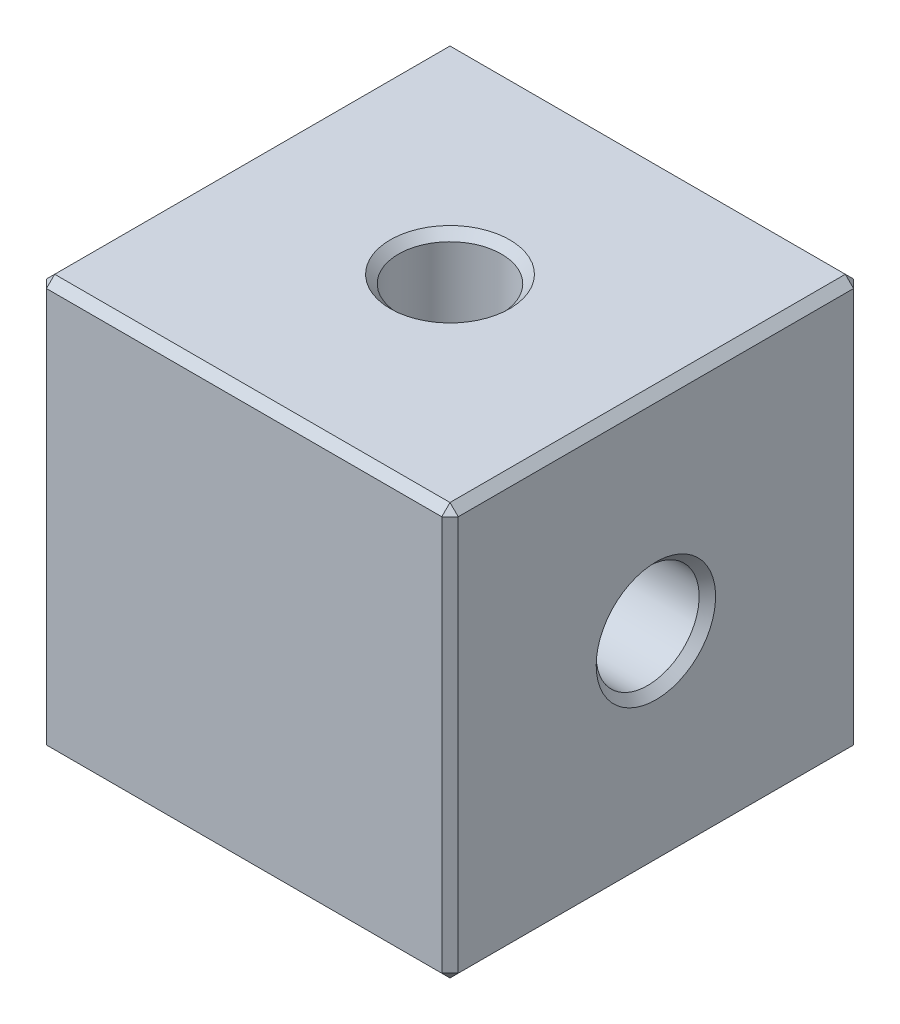
ISO-10303-21;
HEADER;
FILE_DESCRIPTION(('STEP AP214'),'2;1');
FILE_NAME('part.step','',(''),(''),'','','');
FILE_SCHEMA(('AUTOMOTIVE_DESIGN { 1 0 10303 214 1 1 1 1 }'));
ENDSEC;
DATA;
#1=APPLICATION_CONTEXT('core data for automotive mechanical design processes');
#2=APPLICATION_PROTOCOL_DEFINITION('international standard','automotive_design',2000,#1);
#3=PRODUCT_CONTEXT('',#1,'mechanical');
#4=PRODUCT('Part','Part','',(#3));
#5=PRODUCT_RELATED_PRODUCT_CATEGORY('part','',(#4));
#6=PRODUCT_DEFINITION_FORMATION('','',#4);
#7=PRODUCT_DEFINITION_CONTEXT('part definition',#1,'design');
#8=PRODUCT_DEFINITION('design','',#6,#7);
#9=PRODUCT_DEFINITION_SHAPE('','',#8);
#10=(LENGTH_UNIT() NAMED_UNIT(*) SI_UNIT(.MILLI.,.METRE.));
#11=(NAMED_UNIT(*) PLANE_ANGLE_UNIT() SI_UNIT($,.RADIAN.));
#12=(NAMED_UNIT(*) SI_UNIT($,.STERADIAN.) SOLID_ANGLE_UNIT());
#13=UNCERTAINTY_MEASURE_WITH_UNIT(LENGTH_MEASURE(1.E-05),#10,'distance_accuracy_value','');
#14=(GEOMETRIC_REPRESENTATION_CONTEXT(3) GLOBAL_UNCERTAINTY_ASSIGNED_CONTEXT((#13)) GLOBAL_UNIT_ASSIGNED_CONTEXT((#10,
#11,#12)) REPRESENTATION_CONTEXT('',''));
#15=CARTESIAN_POINT('',(0.,0.,0.));
#16=DIRECTION('',(0.,0.,1.));
#17=DIRECTION('',(1.,0.,0.));
#18=AXIS2_PLACEMENT_3D('',#15,#16,#17);
#19=CARTESIAN_POINT('',(5.,5.,-5.));
#20=DIRECTION('',(-1.,0.,0.));
#21=DIRECTION('',(0.,0.,1.));
#22=AXIS2_PLACEMENT_3D('',#19,#20,#21);
#23=PLANE('',#22);
#24=CARTESIAN_POINT('',(5.,0.,0.));
#25=DIRECTION('',(-1.,0.,0.));
#26=DIRECTION('',(0.,0.,1.));
#27=AXIS2_PLACEMENT_3D('',#24,#25,#26);
#28=CIRCLE('',#27,1.44999999999998);
#29=CARTESIAN_POINT('',(5.,0.,1.44999999999998));
#30=VERTEX_POINT('',#29);
#31=EDGE_CURVE('E166',#30,#30,#28,.T.);
#32=ORIENTED_EDGE('',*,*,#31,.T.);
#33=EDGE_LOOP('',(#32));
#34=FACE_BOUND('',#33,.T.);
#35=DIRECTION('',(0.,0.,-1.));
#36=VECTOR('',#35,1.);
#37=CARTESIAN_POINT('',(5.,-4.8,-5.));
#38=LINE('',#37,#36);
#39=CARTESIAN_POINT('',(5.,-4.8,4.8));
#40=VERTEX_POINT('',#39);
#41=CARTESIAN_POINT('',(5.,-4.8,-4.8));
#42=VERTEX_POINT('',#41);
#43=EDGE_CURVE('E165',#40,#42,#38,.T.);
#44=ORIENTED_EDGE('',*,*,#43,.T.);
#45=DIRECTION('',(0.,1.,0.));
#46=VECTOR('',#45,1.);
#47=CARTESIAN_POINT('',(5.,5.,-4.8));
#48=LINE('',#47,#46);
#49=CARTESIAN_POINT('',(5.,4.8,-4.8));
#50=VERTEX_POINT('',#49);
#51=EDGE_CURVE('E140',#42,#50,#48,.T.);
#52=ORIENTED_EDGE('',*,*,#51,.T.);
#53=DIRECTION('',(0.,0.,1.));
#54=VECTOR('',#53,1.);
#55=CARTESIAN_POINT('',(5.,4.8,5.));
#56=LINE('',#55,#54);
#57=CARTESIAN_POINT('',(5.,4.8,4.8));
#58=VERTEX_POINT('',#57);
#59=EDGE_CURVE('E156',#50,#58,#56,.T.);
#60=ORIENTED_EDGE('',*,*,#59,.T.);
#61=DIRECTION('',(0.,-1.,0.));
#62=VECTOR('',#61,1.);
#63=CARTESIAN_POINT('',(5.,5.,4.8));
#64=LINE('',#63,#62);
#65=EDGE_CURVE('E161',#58,#40,#64,.T.);
#66=ORIENTED_EDGE('',*,*,#65,.T.);
#67=EDGE_LOOP('',(#44,#52,#60,#66));
#68=FACE_BOUND('',#67,.T.);
#69=ADVANCED_FACE('F43',(#34,#68),#23,.F.);
#70=CARTESIAN_POINT('',(-5.,5.,-5.));
#71=DIRECTION('',(0.,0.,1.));
#72=DIRECTION('',(1.,0.,0.));
#73=AXIS2_PLACEMENT_3D('',#70,#71,#72);
#74=PLANE('',#73);
#75=DIRECTION('',(-1.,0.,0.));
#76=VECTOR('',#75,1.);
#77=CARTESIAN_POINT('',(-5.,-4.8,-5.));
#78=LINE('',#77,#76);
#79=CARTESIAN_POINT('',(4.8,-4.8,-5.));
#80=VERTEX_POINT('',#79);
#81=CARTESIAN_POINT('',(-4.8,-4.8,-5.));
#82=VERTEX_POINT('',#81);
#83=EDGE_CURVE('E194',#80,#82,#78,.T.);
#84=ORIENTED_EDGE('',*,*,#83,.T.);
#85=DIRECTION('',(0.,1.,0.));
#86=VECTOR('',#85,1.);
#87=CARTESIAN_POINT('',(-4.8,5.,-5.));
#88=LINE('',#87,#86);
#89=CARTESIAN_POINT('',(-4.8,4.8,-5.));
#90=VERTEX_POINT('',#89);
#91=EDGE_CURVE('E196',#82,#90,#88,.T.);
#92=ORIENTED_EDGE('',*,*,#91,.T.);
#93=DIRECTION('',(1.,0.,0.));
#94=VECTOR('',#93,1.);
#95=CARTESIAN_POINT('',(5.,4.8,-5.));
#96=LINE('',#95,#94);
#97=CARTESIAN_POINT('',(4.8,4.8,-5.));
#98=VERTEX_POINT('',#97);
#99=EDGE_CURVE('E191',#90,#98,#96,.T.);
#100=ORIENTED_EDGE('',*,*,#99,.T.);
#101=DIRECTION('',(0.,-1.,0.));
#102=VECTOR('',#101,1.);
#103=CARTESIAN_POINT('',(4.8,5.,-5.));
#104=LINE('',#103,#102);
#105=EDGE_CURVE('E142',#98,#80,#104,.T.);
#106=ORIENTED_EDGE('',*,*,#105,.T.);
#107=EDGE_LOOP('',(#84,#92,#100,#106));
#108=FACE_BOUND('',#107,.T.);
#109=ADVANCED_FACE('F325',(#108),#74,.F.);
#110=CARTESIAN_POINT('',(-5.,5.,-5.));
#111=DIRECTION('',(1.,0.,0.));
#112=DIRECTION('',(0.,0.,-1.));
#113=AXIS2_PLACEMENT_3D('',#110,#111,#112);
#114=PLANE('',#113);
#115=DIRECTION('',(0.,-1.,0.));
#116=VECTOR('',#115,1.);
#117=CARTESIAN_POINT('',(-5.,5.,-4.8));
#118=LINE('',#117,#116);
#119=CARTESIAN_POINT('',(-5.,4.8,-4.8));
#120=VERTEX_POINT('',#119);
#121=CARTESIAN_POINT('',(-5.,-4.8,-4.8));
#122=VERTEX_POINT('',#121);
#123=EDGE_CURVE('E177',#120,#122,#118,.T.);
#124=ORIENTED_EDGE('',*,*,#123,.T.);
#125=DIRECTION('',(0.,0.,1.));
#126=VECTOR('',#125,1.);
#127=CARTESIAN_POINT('',(-5.,-4.8,-5.));
#128=LINE('',#127,#126);
#129=CARTESIAN_POINT('',(-5.,-4.8,4.8));
#130=VERTEX_POINT('',#129);
#131=EDGE_CURVE('E179',#122,#130,#128,.T.);
#132=ORIENTED_EDGE('',*,*,#131,.T.);
#133=DIRECTION('',(0.,1.,0.));
#134=VECTOR('',#133,1.);
#135=CARTESIAN_POINT('',(-5.,5.,4.8));
#136=LINE('',#135,#134);
#137=CARTESIAN_POINT('',(-5.,4.8,4.8));
#138=VERTEX_POINT('',#137);
#139=EDGE_CURVE('E175',#130,#138,#136,.T.);
#140=ORIENTED_EDGE('',*,*,#139,.T.);
#141=DIRECTION('',(0.,0.,-1.));
#142=VECTOR('',#141,1.);
#143=CARTESIAN_POINT('',(-5.,4.8,-5.));
#144=LINE('',#143,#142);
#145=EDGE_CURVE('E169',#138,#120,#144,.T.);
#146=ORIENTED_EDGE('',*,*,#145,.T.);
#147=EDGE_LOOP('',(#124,#132,#140,#146));
#148=FACE_BOUND('',#147,.T.);
#149=ADVANCED_FACE('F331',(#148),#114,.F.);
#150=CARTESIAN_POINT('',(-5.,5.,5.));
#151=DIRECTION('',(0.,0.,-1.));
#152=DIRECTION('',(-1.,0.,0.));
#153=AXIS2_PLACEMENT_3D('',#150,#151,#152);
#154=PLANE('',#153);
#155=DIRECTION('',(-1.,0.,0.));
#156=VECTOR('',#155,1.);
#157=CARTESIAN_POINT('',(-5.,4.8,5.));
#158=LINE('',#157,#156);
#159=CARTESIAN_POINT('',(4.8,4.8,5.));
#160=VERTEX_POINT('',#159);
#161=CARTESIAN_POINT('',(-4.8,4.8,5.));
#162=VERTEX_POINT('',#161);
#163=EDGE_CURVE('E199',#160,#162,#158,.T.);
#164=ORIENTED_EDGE('',*,*,#163,.T.);
#165=DIRECTION('',(0.,-1.,0.));
#166=VECTOR('',#165,1.);
#167=CARTESIAN_POINT('',(-4.8,5.,5.));
#168=LINE('',#167,#166);
#169=CARTESIAN_POINT('',(-4.8,-4.8,5.));
#170=VERTEX_POINT('',#169);
#171=EDGE_CURVE('E205',#162,#170,#168,.T.);
#172=ORIENTED_EDGE('',*,*,#171,.T.);
#173=DIRECTION('',(1.,0.,0.));
#174=VECTOR('',#173,1.);
#175=CARTESIAN_POINT('',(-5.,-4.8,5.));
#176=LINE('',#175,#174);
#177=CARTESIAN_POINT('',(4.8,-4.8,5.));
#178=VERTEX_POINT('',#177);
#179=EDGE_CURVE('E203',#170,#178,#176,.T.);
#180=ORIENTED_EDGE('',*,*,#179,.T.);
#181=DIRECTION('',(0.,1.,0.));
#182=VECTOR('',#181,1.);
#183=CARTESIAN_POINT('',(4.8,5.,5.));
#184=LINE('',#183,#182);
#185=EDGE_CURVE('E201',#178,#160,#184,.T.);
#186=ORIENTED_EDGE('',*,*,#185,.T.);
#187=EDGE_LOOP('',(#164,#172,#180,#186));
#188=FACE_BOUND('',#187,.T.);
#189=ADVANCED_FACE('F297',(#188),#154,.F.);
#190=CARTESIAN_POINT('',(0.,5.,0.));
#191=DIRECTION('',(0.,1.,0.));
#192=DIRECTION('',(0.,0.,1.));
#193=AXIS2_PLACEMENT_3D('',#190,#191,#192);
#194=PLANE('',#193);
#195=DIRECTION('',(0.,0.,1.));
#196=VECTOR('',#195,1.);
#197=CARTESIAN_POINT('',(-4.8,5.,5.));
#198=LINE('',#197,#196);
#199=CARTESIAN_POINT('',(-4.80000000000001,5.,-4.8));
#200=VERTEX_POINT('',#199);
#201=CARTESIAN_POINT('',(-4.8,5.,4.8));
#202=VERTEX_POINT('',#201);
#203=EDGE_CURVE('E61',#200,#202,#198,.T.);
#204=ORIENTED_EDGE('',*,*,#203,.T.);
#205=DIRECTION('',(1.,0.,0.));
#206=VECTOR('',#205,1.);
#207=CARTESIAN_POINT('',(5.,5.,4.8));
#208=LINE('',#207,#206);
#209=CARTESIAN_POINT('',(4.8,5.,4.8));
#210=VERTEX_POINT('',#209);
#211=EDGE_CURVE('E53',#202,#210,#208,.T.);
#212=ORIENTED_EDGE('',*,*,#211,.T.);
#213=DIRECTION('',(0.,0.,-1.));
#214=VECTOR('',#213,1.);
#215=CARTESIAN_POINT('',(4.8,5.,-5.));
#216=LINE('',#215,#214);
#217=CARTESIAN_POINT('',(4.8,5.,-4.8));
#218=VERTEX_POINT('',#217);
#219=EDGE_CURVE('E211',#210,#218,#216,.T.);
#220=ORIENTED_EDGE('',*,*,#219,.T.);
#221=DIRECTION('',(-1.,0.,0.));
#222=VECTOR('',#221,1.);
#223=CARTESIAN_POINT('',(-5.,5.,-4.8));
#224=LINE('',#223,#222);
#225=EDGE_CURVE('E66',#218,#200,#224,.T.);
#226=ORIENTED_EDGE('',*,*,#225,.T.);
#227=EDGE_LOOP('',(#204,#212,#220,#226));
#228=FACE_BOUND('',#227,.T.);
#229=CARTESIAN_POINT('',(0.,5.,0.));
#230=DIRECTION('',(0.,1.,0.));
#231=DIRECTION('',(0.,0.,1.));
#232=AXIS2_PLACEMENT_3D('',#229,#230,#231);
#233=CIRCLE('',#232,1.44999999999999);
#234=CARTESIAN_POINT('',(0.,5.,1.44999999999999));
#235=VERTEX_POINT('',#234);
#236=EDGE_CURVE('E208',#235,#235,#233,.F.);
#237=ORIENTED_EDGE('',*,*,#236,.T.);
#238=EDGE_LOOP('',(#237));
#239=FACE_BOUND('',#238,.T.);
#240=ADVANCED_FACE('F276',(#228,#239),#194,.T.);
#241=CARTESIAN_POINT('',(0.,-5.,0.));
#242=DIRECTION('',(0.,1.,0.));
#243=DIRECTION('',(0.,0.,1.));
#244=AXIS2_PLACEMENT_3D('',#241,#242,#243);
#245=PLANE('',#244);
#246=DIRECTION('',(-1.,0.,0.));
#247=VECTOR('',#246,1.);
#248=CARTESIAN_POINT('',(0.,-5.,4.8));
#249=LINE('',#248,#247);
#250=CARTESIAN_POINT('',(4.8,-5.,4.8));
#251=VERTEX_POINT('',#250);
#252=CARTESIAN_POINT('',(-4.8,-5.,4.8));
#253=VERTEX_POINT('',#252);
#254=EDGE_CURVE('E182',#251,#253,#249,.T.);
#255=ORIENTED_EDGE('',*,*,#254,.T.);
#256=DIRECTION('',(0.,0.,-1.));
#257=VECTOR('',#256,1.);
#258=CARTESIAN_POINT('',(-4.8,-5.,0.));
#259=LINE('',#258,#257);
#260=CARTESIAN_POINT('',(-4.8,-5.,-4.8));
#261=VERTEX_POINT('',#260);
#262=EDGE_CURVE('E188',#253,#261,#259,.T.);
#263=ORIENTED_EDGE('',*,*,#262,.T.);
#264=DIRECTION('',(1.,0.,0.));
#265=VECTOR('',#264,1.);
#266=CARTESIAN_POINT('',(0.,-5.,-4.8));
#267=LINE('',#266,#265);
#268=CARTESIAN_POINT('',(4.8,-5.,-4.8));
#269=VERTEX_POINT('',#268);
#270=EDGE_CURVE('E186',#261,#269,#267,.T.);
#271=ORIENTED_EDGE('',*,*,#270,.T.);
#272=DIRECTION('',(0.,0.,1.));
#273=VECTOR('',#272,1.);
#274=CARTESIAN_POINT('',(4.8,-5.,0.));
#275=LINE('',#274,#273);
#276=EDGE_CURVE('E184',#269,#251,#275,.T.);
#277=ORIENTED_EDGE('',*,*,#276,.T.);
#278=EDGE_LOOP('',(#255,#263,#271,#277));
#279=FACE_BOUND('',#278,.T.);
#280=ADVANCED_FACE('F321',(#279),#245,.F.);
#281=CARTESIAN_POINT('',(0.,5.,0.));
#282=DIRECTION('',(0.,1.,0.));
#283=DIRECTION('',(0.,0.,1.));
#284=AXIS2_PLACEMENT_3D('',#281,#282,#283);
#285=CYLINDRICAL_SURFACE('',#284,1.24999999998267);
#286=CARTESIAN_POINT('',(0.,4.79999999998269,0.));
#287=DIRECTION('',(0.,1.,0.));
#288=DIRECTION('',(0.,0.,1.));
#289=AXIS2_PLACEMENT_3D('',#286,#287,#288);
#290=CIRCLE('',#289,1.24999999998267);
#291=CARTESIAN_POINT('',(0.,4.79999999998269,1.24999999998267));
#292=VERTEX_POINT('',#291);
#293=EDGE_CURVE('E11',#292,#292,#290,.T.);
#294=ORIENTED_EDGE('',*,*,#293,.T.);
#295=EDGE_LOOP('',(#294));
#296=FACE_BOUND('',#295,.T.);
#297=CARTESIAN_POINT('',(0.,1.74122868901172E-11,0.));
#298=DIRECTION('',(-0.707106781186547,0.707106781186548,0.));
#299=DIRECTION('',(0.707106781186548,0.707106781186547,0.));
#300=AXIS2_PLACEMENT_3D('',#297,#298,#299);
#301=ELLIPSE('',#300,1.76776695294187,1.24999999998267);
#302=CARTESIAN_POINT('',(1.24999999998267,1.25000000000009,0.));
#303=VERTEX_POINT('',#302);
#304=EDGE_CURVE('E154',#303,#303,#301,.F.);
#305=ORIENTED_EDGE('',*,*,#304,.T.);
#306=EDGE_LOOP('',(#305));
#307=FACE_BOUND('',#306,.T.);
#308=ADVANCED_FACE('F308',(#296,#307),#285,.F.);
#309=CARTESIAN_POINT('',(5.,0.,0.));
#310=DIRECTION('',(1.,0.,0.));
#311=DIRECTION('',(0.,0.,-1.));
#312=AXIS2_PLACEMENT_3D('',#309,#310,#311);
#313=CYLINDRICAL_SURFACE('',#312,1.24999999998267);
#314=CARTESIAN_POINT('',(4.79999999998269,0.,0.));
#315=DIRECTION('',(-1.,0.,0.));
#316=DIRECTION('',(0.,0.,1.));
#317=AXIS2_PLACEMENT_3D('',#314,#315,#316);
#318=CIRCLE('',#317,1.24999999998267);
#319=CARTESIAN_POINT('',(4.79999999998269,0.,1.24999999998267));
#320=VERTEX_POINT('',#319);
#321=EDGE_CURVE('E162',#320,#320,#318,.F.);
#322=ORIENTED_EDGE('',*,*,#321,.T.);
#323=EDGE_LOOP('',(#322));
#324=FACE_BOUND('',#323,.T.);
#325=ORIENTED_EDGE('',*,*,#304,.F.);
#326=EDGE_LOOP('',(#325));
#327=FACE_BOUND('',#326,.T.);
#328=ADVANCED_FACE('F310',(#324,#327),#313,.F.);
#329=CARTESIAN_POINT('',(4.79999999998269,0.,0.));
#330=DIRECTION('',(1.,0.,0.));
#331=DIRECTION('',(0.,0.,-1.));
#332=AXIS2_PLACEMENT_3D('',#329,#330,#331);
#333=CONICAL_SURFACE('',#332,1.24999999998267,0.785398163397453);
#334=ORIENTED_EDGE('',*,*,#31,.F.);
#335=EDGE_LOOP('',(#334));
#336=FACE_BOUND('',#335,.T.);
#337=ORIENTED_EDGE('',*,*,#321,.F.);
#338=EDGE_LOOP('',(#337));
#339=FACE_BOUND('',#338,.T.);
#340=ADVANCED_FACE('F312',(#336,#339),#333,.F.);
#341=CARTESIAN_POINT('',(4.8,5.,0.));
#342=DIRECTION('',(0.707106781186554,0.707106781186541,0.));
#343=DIRECTION('',(0.,0.,1.));
#344=AXIS2_PLACEMENT_3D('',#341,#342,#343);
#345=PLANE('',#344);
#346=DIRECTION('',(0.707106781186541,-0.707106781186555,0.));
#347=VECTOR('',#346,1.);
#348=CARTESIAN_POINT('',(5.,4.8,-4.8));
#349=LINE('',#348,#347);
#350=EDGE_CURVE('E48',#218,#50,#349,.T.);
#351=ORIENTED_EDGE('',*,*,#350,.F.);
#352=ORIENTED_EDGE('',*,*,#219,.F.);
#353=DIRECTION('',(-0.70710678118654,0.707106781186554,0.));
#354=VECTOR('',#353,1.);
#355=CARTESIAN_POINT('',(4.9,4.9,4.8));
#356=LINE('',#355,#354);
#357=EDGE_CURVE('E145',#58,#210,#356,.T.);
#358=ORIENTED_EDGE('',*,*,#357,.F.);
#359=ORIENTED_EDGE('',*,*,#59,.F.);
#360=EDGE_LOOP('',(#351,#352,#358,#359));
#361=FACE_BOUND('',#360,.T.);
#362=ADVANCED_FACE('F157',(#361),#345,.T.);
#363=CARTESIAN_POINT('',(5.,4.8,-4.8));
#364=DIRECTION('',(0.577350269189637,0.577350269189615,-0.577350269189625));
#365=DIRECTION('',(-0.70710678118654,0.,-0.707106781186555));
#366=AXIS2_PLACEMENT_3D('',#363,#364,#365);
#367=PLANE('',#366);
#368=DIRECTION('',(0.,0.707106781186554,0.707106781186541));
#369=VECTOR('',#368,1.);
#370=CARTESIAN_POINT('',(4.8,4.9,-4.9));
#371=LINE('',#370,#369);
#372=EDGE_CURVE('E146',#218,#98,#371,.F.);
#373=ORIENTED_EDGE('',*,*,#372,.F.);
#374=ORIENTED_EDGE('',*,*,#350,.T.);
#375=DIRECTION('',(0.70710678118654,0.,0.707106781186555));
#376=VECTOR('',#375,1.);
#377=CARTESIAN_POINT('',(5.,4.8,-4.8));
#378=LINE('',#377,#376);
#379=EDGE_CURVE('E135',#98,#50,#378,.T.);
#380=ORIENTED_EDGE('',*,*,#379,.F.);
#381=EDGE_LOOP('',(#373,#374,#380));
#382=FACE_BOUND('',#381,.T.);
#383=ADVANCED_FACE('F150',(#382),#367,.T.);
#384=CARTESIAN_POINT('',(4.8,4.8,5.));
#385=DIRECTION('',(0.577350269189637,0.577350269189615,0.577350269189625));
#386=DIRECTION('',(0.70710678118654,0.,-0.707106781186555));
#387=AXIS2_PLACEMENT_3D('',#384,#385,#386);
#388=PLANE('',#387);
#389=DIRECTION('',(-0.70710678118654,0.,0.707106781186555));
#390=VECTOR('',#389,1.);
#391=CARTESIAN_POINT('',(4.8,4.8,5.));
#392=LINE('',#391,#390);
#393=EDGE_CURVE('E266',#58,#160,#392,.T.);
#394=ORIENTED_EDGE('',*,*,#393,.F.);
#395=ORIENTED_EDGE('',*,*,#357,.T.);
#396=DIRECTION('',(0.,-0.707106781186554,0.707106781186541));
#397=VECTOR('',#396,1.);
#398=CARTESIAN_POINT('',(4.8,4.8,5.));
#399=LINE('',#398,#397);
#400=EDGE_CURVE('E269',#160,#210,#399,.F.);
#401=ORIENTED_EDGE('',*,*,#400,.F.);
#402=EDGE_LOOP('',(#394,#395,#401));
#403=FACE_BOUND('',#402,.T.);
#404=ADVANCED_FACE('F273',(#403),#388,.T.);
#405=CARTESIAN_POINT('',(4.8,5.,-5.));
#406=DIRECTION('',(-0.707106781186555,0.,0.70710678118654));
#407=DIRECTION('',(0.,-1.,0.));
#408=AXIS2_PLACEMENT_3D('',#405,#406,#407);
#409=PLANE('',#408);
#410=ORIENTED_EDGE('',*,*,#379,.T.);
#411=ORIENTED_EDGE('',*,*,#51,.F.);
#412=DIRECTION('',(-0.70710678118654,0.,-0.707106781186555));
#413=VECTOR('',#412,1.);
#414=CARTESIAN_POINT('',(4.9,-4.8,-4.9));
#415=LINE('',#414,#413);
#416=EDGE_CURVE('E260',#80,#42,#415,.F.);
#417=ORIENTED_EDGE('',*,*,#416,.F.);
#418=ORIENTED_EDGE('',*,*,#105,.F.);
#419=EDGE_LOOP('',(#410,#411,#417,#418));
#420=FACE_BOUND('',#419,.T.);
#421=ADVANCED_FACE('F137',(#420),#409,.F.);
#422=CARTESIAN_POINT('',(0.,5.,-4.8));
#423=DIRECTION('',(0.,0.707106781186541,-0.707106781186554));
#424=DIRECTION('',(1.,0.,0.));
#425=AXIS2_PLACEMENT_3D('',#422,#423,#424);
#426=PLANE('',#425);
#427=ORIENTED_EDGE('',*,*,#372,.T.);
#428=ORIENTED_EDGE('',*,*,#99,.F.);
#429=DIRECTION('',(0.,-0.707106781186553,-0.707106781186541));
#430=VECTOR('',#429,1.);
#431=CARTESIAN_POINT('',(-4.8,4.8,-5.));
#432=LINE('',#431,#430);
#433=EDGE_CURVE('E257',#200,#90,#432,.T.);
#434=ORIENTED_EDGE('',*,*,#433,.F.);
#435=ORIENTED_EDGE('',*,*,#225,.F.);
#436=EDGE_LOOP('',(#427,#428,#434,#435));
#437=FACE_BOUND('',#436,.T.);
#438=ADVANCED_FACE('F436',(#437),#426,.T.);
#439=CARTESIAN_POINT('',(-4.8,5.,0.));
#440=DIRECTION('',(-0.707106781186554,0.707106781186541,0.));
#441=DIRECTION('',(0.,0.,-1.));
#442=AXIS2_PLACEMENT_3D('',#439,#440,#441);
#443=PLANE('',#442);
#444=DIRECTION('',(-0.707106781186541,-0.707106781186554,0.));
#445=VECTOR('',#444,1.);
#446=CARTESIAN_POINT('',(-5.,4.8,4.8));
#447=LINE('',#446,#445);
#448=EDGE_CURVE('E251',#202,#138,#447,.T.);
#449=ORIENTED_EDGE('',*,*,#448,.F.);
#450=ORIENTED_EDGE('',*,*,#203,.F.);
#451=DIRECTION('',(0.707106781186541,0.707106781186554,0.));
#452=VECTOR('',#451,1.);
#453=CARTESIAN_POINT('',(-4.9,4.9,-4.8));
#454=LINE('',#453,#452);
#455=EDGE_CURVE('E254',#120,#200,#454,.T.);
#456=ORIENTED_EDGE('',*,*,#455,.F.);
#457=ORIENTED_EDGE('',*,*,#145,.F.);
#458=EDGE_LOOP('',(#449,#450,#456,#457));
#459=FACE_BOUND('',#458,.T.);
#460=ADVANCED_FACE('F285',(#459),#443,.T.);
#461=CARTESIAN_POINT('',(0.,5.,4.8));
#462=DIRECTION('',(0.,0.707106781186541,0.707106781186554));
#463=DIRECTION('',(-1.,0.,0.));
#464=AXIS2_PLACEMENT_3D('',#461,#462,#463);
#465=PLANE('',#464);
#466=ORIENTED_EDGE('',*,*,#400,.T.);
#467=ORIENTED_EDGE('',*,*,#211,.F.);
#468=DIRECTION('',(0.,0.707106781186554,-0.707106781186541));
#469=VECTOR('',#468,1.);
#470=CARTESIAN_POINT('',(-4.8,4.9,4.9));
#471=LINE('',#470,#469);
#472=EDGE_CURVE('E248',#162,#202,#471,.T.);
#473=ORIENTED_EDGE('',*,*,#472,.F.);
#474=ORIENTED_EDGE('',*,*,#163,.F.);
#475=EDGE_LOOP('',(#466,#467,#473,#474));
#476=FACE_BOUND('',#475,.T.);
#477=ADVANCED_FACE('F281',(#476),#465,.T.);
#478=CARTESIAN_POINT('',(5.,5.,4.8));
#479=DIRECTION('',(-0.707106781186555,0.,-0.70710678118654));
#480=DIRECTION('',(0.,-1.,0.));
#481=AXIS2_PLACEMENT_3D('',#478,#479,#480);
#482=PLANE('',#481);
#483=ORIENTED_EDGE('',*,*,#393,.T.);
#484=ORIENTED_EDGE('',*,*,#185,.F.);
#485=DIRECTION('',(0.70710678118654,0.,-0.707106781186555));
#486=VECTOR('',#485,1.);
#487=CARTESIAN_POINT('',(4.9,-4.8,4.9));
#488=LINE('',#487,#486);
#489=EDGE_CURVE('E245',#40,#178,#488,.F.);
#490=ORIENTED_EDGE('',*,*,#489,.F.);
#491=ORIENTED_EDGE('',*,*,#65,.F.);
#492=EDGE_LOOP('',(#483,#484,#490,#491));
#493=FACE_BOUND('',#492,.T.);
#494=ADVANCED_FACE('F301',(#493),#482,.F.);
#495=CARTESIAN_POINT('',(5.,-4.8,-5.));
#496=DIRECTION('',(-0.707106781186554,0.707106781186541,0.));
#497=DIRECTION('',(0.,0.,-1.));
#498=AXIS2_PLACEMENT_3D('',#495,#496,#497);
#499=PLANE('',#498);
#500=DIRECTION('',(0.707106781186541,0.707106781186554,0.));
#501=VECTOR('',#500,1.);
#502=CARTESIAN_POINT('',(4.8,-5.,-4.8));
#503=LINE('',#502,#501);
#504=EDGE_CURVE('E263',#42,#269,#503,.F.);
#505=ORIENTED_EDGE('',*,*,#504,.F.);
#506=ORIENTED_EDGE('',*,*,#43,.F.);
#507=DIRECTION('',(-0.70710678118654,-0.707106781186554,0.));
#508=VECTOR('',#507,1.);
#509=CARTESIAN_POINT('',(4.8,-5.,4.8));
#510=LINE('',#509,#508);
#511=EDGE_CURVE('E242',#251,#40,#510,.F.);
#512=ORIENTED_EDGE('',*,*,#511,.F.);
#513=ORIENTED_EDGE('',*,*,#276,.F.);
#514=EDGE_LOOP('',(#505,#506,#512,#513));
#515=FACE_BOUND('',#514,.T.);
#516=ADVANCED_FACE('F413',(#515),#499,.F.);
#517=CARTESIAN_POINT('',(4.8,-5.,-4.8));
#518=DIRECTION('',(0.577350269189637,-0.577350269189625,-0.577350269189615));
#519=DIRECTION('',(0.70710678118654,0.707106781186555,0.));
#520=AXIS2_PLACEMENT_3D('',#517,#518,#519);
#521=PLANE('',#520);
#522=ORIENTED_EDGE('',*,*,#416,.T.);
#523=ORIENTED_EDGE('',*,*,#504,.T.);
#524=DIRECTION('',(0.,-0.707106781186541,0.707106781186554));
#525=VECTOR('',#524,1.);
#526=CARTESIAN_POINT('',(4.8,-5.,-4.8));
#527=LINE('',#526,#525);
#528=EDGE_CURVE('E239',#80,#269,#527,.T.);
#529=ORIENTED_EDGE('',*,*,#528,.F.);
#530=EDGE_LOOP('',(#522,#523,#529));
#531=FACE_BOUND('',#530,.T.);
#532=ADVANCED_FACE('F406',(#531),#521,.T.);
#533=CARTESIAN_POINT('',(-4.8,4.8,-5.));
#534=DIRECTION('',(-0.577350269189627,0.577350269189614,-0.577350269189637));
#535=DIRECTION('',(-0.707106781186554,0.,0.707106781186541));
#536=AXIS2_PLACEMENT_3D('',#533,#534,#535);
#537=PLANE('',#536);
#538=ORIENTED_EDGE('',*,*,#455,.T.);
#539=ORIENTED_EDGE('',*,*,#433,.T.);
#540=DIRECTION('',(0.707106781186554,0.,-0.707106781186541));
#541=VECTOR('',#540,1.);
#542=CARTESIAN_POINT('',(-4.8,4.8,-5.));
#543=LINE('',#542,#541);
#544=EDGE_CURVE('E237',#120,#90,#543,.T.);
#545=ORIENTED_EDGE('',*,*,#544,.F.);
#546=EDGE_LOOP('',(#538,#539,#545));
#547=FACE_BOUND('',#546,.T.);
#548=ADVANCED_FACE('F400',(#547),#537,.T.);
#549=CARTESIAN_POINT('',(-5.,4.8,4.8));
#550=DIRECTION('',(-0.577350269189637,0.577350269189614,0.577350269189627));
#551=DIRECTION('',(0.707106781186541,0.,0.707106781186554));
#552=AXIS2_PLACEMENT_3D('',#549,#550,#551);
#553=PLANE('',#552);
#554=ORIENTED_EDGE('',*,*,#472,.T.);
#555=ORIENTED_EDGE('',*,*,#448,.T.);
#556=DIRECTION('',(-0.707106781186541,0.,-0.707106781186554));
#557=VECTOR('',#556,1.);
#558=CARTESIAN_POINT('',(-5.,4.8,4.8));
#559=LINE('',#558,#557);
#560=EDGE_CURVE('E234',#162,#138,#559,.T.);
#561=ORIENTED_EDGE('',*,*,#560,.F.);
#562=EDGE_LOOP('',(#554,#555,#561));
#563=FACE_BOUND('',#562,.T.);
#564=ADVANCED_FACE('F289',(#563),#553,.T.);
#565=CARTESIAN_POINT('',(4.8,-5.,4.8));
#566=DIRECTION('',(0.577350269189637,-0.577350269189625,0.577350269189615));
#567=DIRECTION('',(0.70710678118654,0.707106781186555,0.));
#568=AXIS2_PLACEMENT_3D('',#565,#566,#567);
#569=PLANE('',#568);
#570=ORIENTED_EDGE('',*,*,#511,.T.);
#571=ORIENTED_EDGE('',*,*,#489,.T.);
#572=DIRECTION('',(0.,0.707106781186541,0.707106781186554));
#573=VECTOR('',#572,1.);
#574=CARTESIAN_POINT('',(4.8,-5.,4.8));
#575=LINE('',#574,#573);
#576=EDGE_CURVE('E231',#251,#178,#575,.T.);
#577=ORIENTED_EDGE('',*,*,#576,.F.);
#578=EDGE_LOOP('',(#570,#571,#577));
#579=FACE_BOUND('',#578,.T.);
#580=ADVANCED_FACE('F387',(#579),#569,.T.);
#581=CARTESIAN_POINT('',(-5.,-4.8,-5.));
#582=DIRECTION('',(0.,0.707106781186554,0.707106781186541));
#583=DIRECTION('',(-1.,0.,0.));
#584=AXIS2_PLACEMENT_3D('',#581,#582,#583);
#585=PLANE('',#584);
#586=ORIENTED_EDGE('',*,*,#528,.T.);
#587=ORIENTED_EDGE('',*,*,#270,.F.);
#588=DIRECTION('',(0.,0.707106781186541,-0.707106781186554));
#589=VECTOR('',#588,1.);
#590=CARTESIAN_POINT('',(-4.8,-5.,-4.8));
#591=LINE('',#590,#589);
#592=EDGE_CURVE('E228',#82,#261,#591,.F.);
#593=ORIENTED_EDGE('',*,*,#592,.F.);
#594=ORIENTED_EDGE('',*,*,#83,.F.);
#595=EDGE_LOOP('',(#586,#587,#593,#594));
#596=FACE_BOUND('',#595,.T.);
#597=ADVANCED_FACE('F380',(#596),#585,.F.);
#598=CARTESIAN_POINT('',(-5.,5.,-4.8));
#599=DIRECTION('',(0.707106781186541,0.,0.707106781186554));
#600=DIRECTION('',(0.,-1.,0.));
#601=AXIS2_PLACEMENT_3D('',#598,#599,#600);
#602=PLANE('',#601);
#603=ORIENTED_EDGE('',*,*,#544,.T.);
#604=ORIENTED_EDGE('',*,*,#91,.F.);
#605=DIRECTION('',(-0.707106781186554,0.,0.707106781186541));
#606=VECTOR('',#605,1.);
#607=CARTESIAN_POINT('',(-4.9,-4.8,-4.9));
#608=LINE('',#607,#606);
#609=EDGE_CURVE('E225',#122,#82,#608,.F.);
#610=ORIENTED_EDGE('',*,*,#609,.F.);
#611=ORIENTED_EDGE('',*,*,#123,.F.);
#612=EDGE_LOOP('',(#603,#604,#610,#611));
#613=FACE_BOUND('',#612,.T.);
#614=ADVANCED_FACE('F374',(#613),#602,.F.);
#615=CARTESIAN_POINT('',(-4.8,5.,5.));
#616=DIRECTION('',(0.707106781186554,0.,-0.707106781186541));
#617=DIRECTION('',(0.,-1.,0.));
#618=AXIS2_PLACEMENT_3D('',#615,#616,#617);
#619=PLANE('',#618);
#620=ORIENTED_EDGE('',*,*,#560,.T.);
#621=ORIENTED_EDGE('',*,*,#139,.F.);
#622=DIRECTION('',(0.707106781186541,0.,0.707106781186554));
#623=VECTOR('',#622,1.);
#624=CARTESIAN_POINT('',(-5.,-4.8,4.8));
#625=LINE('',#624,#623);
#626=EDGE_CURVE('E222',#170,#130,#625,.F.);
#627=ORIENTED_EDGE('',*,*,#626,.F.);
#628=ORIENTED_EDGE('',*,*,#171,.F.);
#629=EDGE_LOOP('',(#620,#621,#627,#628));
#630=FACE_BOUND('',#629,.T.);
#631=ADVANCED_FACE('F294',(#630),#619,.F.);
#632=CARTESIAN_POINT('',(-5.,-4.8,5.));
#633=DIRECTION('',(0.,0.707106781186554,-0.707106781186541));
#634=DIRECTION('',(1.,0.,0.));
#635=AXIS2_PLACEMENT_3D('',#632,#633,#634);
#636=PLANE('',#635);
#637=ORIENTED_EDGE('',*,*,#576,.T.);
#638=ORIENTED_EDGE('',*,*,#179,.F.);
#639=DIRECTION('',(0.,-0.707106781186541,-0.707106781186554));
#640=VECTOR('',#639,1.);
#641=CARTESIAN_POINT('',(-4.8,-4.9,4.9));
#642=LINE('',#641,#640);
#643=EDGE_CURVE('E220',#253,#170,#642,.F.);
#644=ORIENTED_EDGE('',*,*,#643,.F.);
#645=ORIENTED_EDGE('',*,*,#254,.F.);
#646=EDGE_LOOP('',(#637,#638,#644,#645));
#647=FACE_BOUND('',#646,.T.);
#648=ADVANCED_FACE('F361',(#647),#636,.F.);
#649=CARTESIAN_POINT('',(-4.8,-5.,-4.8));
#650=DIRECTION('',(-0.577350269189616,-0.577350269189636,-0.577350269189626));
#651=DIRECTION('',(0.,0.707106781186541,-0.707106781186554));
#652=AXIS2_PLACEMENT_3D('',#649,#650,#651);
#653=PLANE('',#652);
#654=ORIENTED_EDGE('',*,*,#609,.T.);
#655=ORIENTED_EDGE('',*,*,#592,.T.);
#656=DIRECTION('',(0.707106781186553,-0.707106781186542,0.));
#657=VECTOR('',#656,1.);
#658=CARTESIAN_POINT('',(-4.8,-5.,-4.8));
#659=LINE('',#658,#657);
#660=EDGE_CURVE('E218',#122,#261,#659,.T.);
#661=ORIENTED_EDGE('',*,*,#660,.F.);
#662=EDGE_LOOP('',(#654,#655,#661));
#663=FACE_BOUND('',#662,.T.);
#664=ADVANCED_FACE('F354',(#663),#653,.T.);
#665=CARTESIAN_POINT('',(-5.,-4.8,4.8));
#666=DIRECTION('',(-0.577350269189626,-0.577350269189636,0.577350269189616));
#667=DIRECTION('',(0.707106781186554,-0.707106781186541,0.));
#668=AXIS2_PLACEMENT_3D('',#665,#666,#667);
#669=PLANE('',#668);
#670=ORIENTED_EDGE('',*,*,#643,.T.);
#671=ORIENTED_EDGE('',*,*,#626,.T.);
#672=DIRECTION('',(-0.707106781186553,0.707106781186542,0.));
#673=VECTOR('',#672,1.);
#674=CARTESIAN_POINT('',(-5.,-4.8,4.8));
#675=LINE('',#674,#673);
#676=EDGE_CURVE('E216',#253,#130,#675,.T.);
#677=ORIENTED_EDGE('',*,*,#676,.F.);
#678=EDGE_LOOP('',(#670,#671,#677));
#679=FACE_BOUND('',#678,.T.);
#680=ADVANCED_FACE('F347',(#679),#669,.T.);
#681=CARTESIAN_POINT('',(-5.,-4.8,-5.));
#682=DIRECTION('',(0.707106781186542,0.707106781186553,0.));
#683=DIRECTION('',(0.,0.,1.));
#684=AXIS2_PLACEMENT_3D('',#681,#682,#683);
#685=PLANE('',#684);
#686=ORIENTED_EDGE('',*,*,#660,.T.);
#687=ORIENTED_EDGE('',*,*,#262,.F.);
#688=ORIENTED_EDGE('',*,*,#676,.T.);
#689=ORIENTED_EDGE('',*,*,#131,.F.);
#690=EDGE_LOOP('',(#686,#687,#688,#689));
#691=FACE_BOUND('',#690,.T.);
#692=ADVANCED_FACE('F341',(#691),#685,.F.);
#693=CARTESIAN_POINT('',(0.,4.79999999998269,0.));
#694=DIRECTION('',(0.,1.,0.));
#695=DIRECTION('',(0.,0.,1.));
#696=AXIS2_PLACEMENT_3D('',#693,#694,#695);
#697=CONICAL_SURFACE('',#696,1.24999999998267,0.785398163397453);
#698=ORIENTED_EDGE('',*,*,#236,.F.);
#699=EDGE_LOOP('',(#698));
#700=FACE_BOUND('',#699,.T.);
#701=ORIENTED_EDGE('',*,*,#293,.F.);
#702=EDGE_LOOP('',(#701));
#703=FACE_BOUND('',#702,.T.);
#704=ADVANCED_FACE('F46',(#700,#703),#697,.F.);
#705=CLOSED_SHELL('',(#69,#109,#149,#189,#240,#280,#308,#328,#340,#362,#383,#404,#421,#438,#460,
#477,#494,#516,#532,#548,#564,#580,#597,#614,#631,#648,#664,#680,#692,#704));
#706=MANIFOLD_SOLID_BREP('B2',#705);
#707=ADVANCED_BREP_SHAPE_REPRESENTATION('',(#18,#706),#14);
#708=SHAPE_DEFINITION_REPRESENTATION(#9,#707);
ENDSEC;
END-ISO-10303-21;
